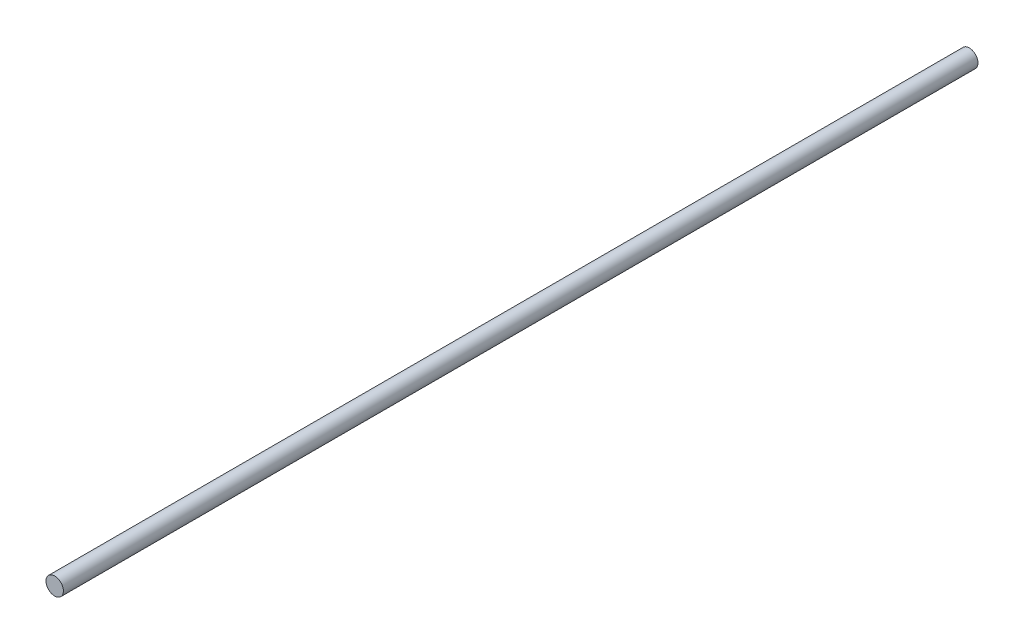
ISO-10303-21;
HEADER;
FILE_DESCRIPTION(('STEP AP214'),'2;1');
FILE_NAME('part.step','',(''),(''),'','','');
FILE_SCHEMA(('AUTOMOTIVE_DESIGN { 1 0 10303 214 1 1 1 1 }'));
ENDSEC;
DATA;
#1=APPLICATION_CONTEXT('core data for automotive mechanical design processes');
#2=APPLICATION_PROTOCOL_DEFINITION('international standard','automotive_design',2000,#1);
#3=PRODUCT_CONTEXT('',#1,'mechanical');
#4=PRODUCT('Part','Part','',(#3));
#5=PRODUCT_RELATED_PRODUCT_CATEGORY('part','',(#4));
#6=PRODUCT_DEFINITION_FORMATION('','',#4);
#7=PRODUCT_DEFINITION_CONTEXT('part definition',#1,'design');
#8=PRODUCT_DEFINITION('design','',#6,#7);
#9=PRODUCT_DEFINITION_SHAPE('','',#8);
#10=(LENGTH_UNIT() NAMED_UNIT(*) SI_UNIT(.MILLI.,.METRE.));
#11=(NAMED_UNIT(*) PLANE_ANGLE_UNIT() SI_UNIT($,.RADIAN.));
#12=(NAMED_UNIT(*) SI_UNIT($,.STERADIAN.) SOLID_ANGLE_UNIT());
#13=UNCERTAINTY_MEASURE_WITH_UNIT(LENGTH_MEASURE(1.E-05),#10,'distance_accuracy_value','');
#14=(GEOMETRIC_REPRESENTATION_CONTEXT(3) GLOBAL_UNCERTAINTY_ASSIGNED_CONTEXT((#13)) GLOBAL_UNIT_ASSIGNED_CONTEXT((#10,
#11,#12)) REPRESENTATION_CONTEXT('',''));
#15=CARTESIAN_POINT('',(0.,0.,0.));
#16=DIRECTION('',(0.,0.,1.));
#17=DIRECTION('',(1.,0.,0.));
#18=AXIS2_PLACEMENT_3D('',#15,#16,#17);
#19=CARTESIAN_POINT('',(20.,0.,-105.));
#20=DIRECTION('',(0.,0.,1.));
#21=DIRECTION('',(1.,0.,0.));
#22=AXIS2_PLACEMENT_3D('',#19,#20,#21);
#23=CYLINDRICAL_SURFACE('',#22,1.);
#24=CARTESIAN_POINT('',(20.,0.,-105.));
#25=DIRECTION('',(0.,0.,1.));
#26=DIRECTION('',(1.,0.,0.));
#27=AXIS2_PLACEMENT_3D('',#24,#25,#26);
#28=CIRCLE('',#27,1.);
#29=CARTESIAN_POINT('',(21.,0.,-105.));
#30=VERTEX_POINT('',#29);
#31=EDGE_CURVE('E10',#30,#30,#28,.T.);
#32=ORIENTED_EDGE('',*,*,#31,.T.);
#33=EDGE_LOOP('',(#32));
#34=FACE_BOUND('',#33,.T.);
#35=CARTESIAN_POINT('',(20.,0.,0.));
#36=DIRECTION('',(0.,0.,1.));
#37=DIRECTION('',(1.,0.,0.));
#38=AXIS2_PLACEMENT_3D('',#35,#36,#37);
#39=CIRCLE('',#38,1.);
#40=CARTESIAN_POINT('',(21.,0.,0.));
#41=VERTEX_POINT('',#40);
#42=EDGE_CURVE('E36',#41,#41,#39,.T.);
#43=ORIENTED_EDGE('',*,*,#42,.F.);
#44=EDGE_LOOP('',(#43));
#45=FACE_BOUND('',#44,.T.);
#46=ADVANCED_FACE('F33',(#34,#45),#23,.T.);
#47=CARTESIAN_POINT('',(20.,0.,-105.));
#48=DIRECTION('',(0.,0.,1.));
#49=DIRECTION('',(1.,0.,0.));
#50=AXIS2_PLACEMENT_3D('',#47,#48,#49);
#51=PLANE('',#50);
#52=ORIENTED_EDGE('',*,*,#31,.F.);
#53=EDGE_LOOP('',(#52));
#54=FACE_BOUND('',#53,.T.);
#55=ADVANCED_FACE('F48',(#54),#51,.F.);
#56=CARTESIAN_POINT('',(20.,0.,0.));
#57=DIRECTION('',(0.,0.,1.));
#58=DIRECTION('',(1.,0.,0.));
#59=AXIS2_PLACEMENT_3D('',#56,#57,#58);
#60=PLANE('',#59);
#61=ORIENTED_EDGE('',*,*,#42,.T.);
#62=EDGE_LOOP('',(#61));
#63=FACE_BOUND('',#62,.T.);
#64=ADVANCED_FACE('F45',(#63),#60,.T.);
#65=CLOSED_SHELL('',(#46,#55,#64));
#66=MANIFOLD_SOLID_BREP('B2',#65);
#67=ADVANCED_BREP_SHAPE_REPRESENTATION('',(#18,#66),#14);
#68=SHAPE_DEFINITION_REPRESENTATION(#9,#67);
ENDSEC;
END-ISO-10303-21;
